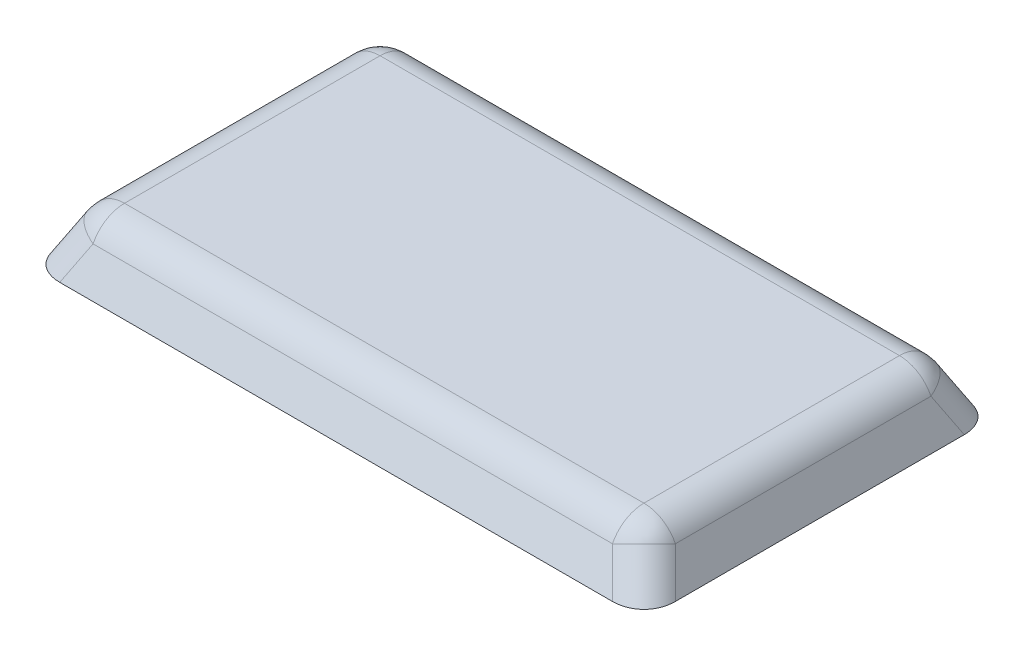
ISO-10303-21;
HEADER;
FILE_DESCRIPTION(('STEP AP214'),'2;1');
FILE_NAME('part.step','',(''),(''),'','','');
FILE_SCHEMA(('AUTOMOTIVE_DESIGN { 1 0 10303 214 1 1 1 1 }'));
ENDSEC;
DATA;
#1=APPLICATION_CONTEXT('core data for automotive mechanical design processes');
#2=APPLICATION_PROTOCOL_DEFINITION('international standard','automotive_design',2000,#1);
#3=PRODUCT_CONTEXT('',#1,'mechanical');
#4=PRODUCT('Part','Part','',(#3));
#5=PRODUCT_RELATED_PRODUCT_CATEGORY('part','',(#4));
#6=PRODUCT_DEFINITION_FORMATION('','',#4);
#7=PRODUCT_DEFINITION_CONTEXT('part definition',#1,'design');
#8=PRODUCT_DEFINITION('design','',#6,#7);
#9=PRODUCT_DEFINITION_SHAPE('','',#8);
#10=(LENGTH_UNIT() NAMED_UNIT(*) SI_UNIT(.MILLI.,.METRE.));
#11=(NAMED_UNIT(*) PLANE_ANGLE_UNIT() SI_UNIT($,.RADIAN.));
#12=(NAMED_UNIT(*) SI_UNIT($,.STERADIAN.) SOLID_ANGLE_UNIT());
#13=UNCERTAINTY_MEASURE_WITH_UNIT(LENGTH_MEASURE(1.E-05),#10,'distance_accuracy_value','');
#14=(GEOMETRIC_REPRESENTATION_CONTEXT(3) GLOBAL_UNCERTAINTY_ASSIGNED_CONTEXT((#13)) GLOBAL_UNIT_ASSIGNED_CONTEXT((#10,
#11,#12)) REPRESENTATION_CONTEXT('',''));
#15=CARTESIAN_POINT('',(0.,0.,0.));
#16=DIRECTION('',(0.,0.,1.));
#17=DIRECTION('',(1.,0.,0.));
#18=AXIS2_PLACEMENT_3D('',#15,#16,#17);
#19=CARTESIAN_POINT('',(0.,6.,0.));
#20=DIRECTION('',(0.,-1.,0.));
#21=DIRECTION('',(0.,0.,-1.));
#22=AXIS2_PLACEMENT_3D('',#19,#20,#21);
#23=PLANE('',#22);
#24=DIRECTION('',(-1.,0.,0.));
#25=VECTOR('',#24,1.);
#26=CARTESIAN_POINT('',(0.,6.,-14.5278640450004));
#27=LINE('',#26,#25);
#28=CARTESIAN_POINT('',(29.5278640450004,6.,-14.5278640450004));
#29=VERTEX_POINT('',#28);
#30=CARTESIAN_POINT('',(-29.5278640450004,6.,-14.5278640450004));
#31=VERTEX_POINT('',#30);
#32=EDGE_CURVE('E196',#29,#31,#27,.T.);
#33=ORIENTED_EDGE('',*,*,#32,.T.);
#34=DIRECTION('',(0.,0.,1.));
#35=VECTOR('',#34,1.);
#36=CARTESIAN_POINT('',(-29.5278640450004,6.,0.));
#37=LINE('',#36,#35);
#38=CARTESIAN_POINT('',(-29.5278640450004,6.,14.5278640450004));
#39=VERTEX_POINT('',#38);
#40=EDGE_CURVE('E203',#31,#39,#37,.T.);
#41=ORIENTED_EDGE('',*,*,#40,.T.);
#42=DIRECTION('',(1.,0.,0.));
#43=VECTOR('',#42,1.);
#44=CARTESIAN_POINT('',(0.,6.,14.5278640450004));
#45=LINE('',#44,#43);
#46=CARTESIAN_POINT('',(29.5278640450004,6.,14.5278640450004));
#47=VERTEX_POINT('',#46);
#48=EDGE_CURVE('E193',#39,#47,#45,.T.);
#49=ORIENTED_EDGE('',*,*,#48,.T.);
#50=DIRECTION('',(0.,0.,-1.));
#51=VECTOR('',#50,1.);
#52=CARTESIAN_POINT('',(29.5278640450004,6.,0.));
#53=LINE('',#52,#51);
#54=EDGE_CURVE('E189',#47,#29,#53,.T.);
#55=ORIENTED_EDGE('',*,*,#54,.T.);
#56=EDGE_LOOP('',(#33,#41,#49,#55));
#57=FACE_BOUND('',#56,.T.);
#58=ADVANCED_FACE('F54',(#57),#23,.F.);
#59=CARTESIAN_POINT('',(0.,0.,0.));
#60=DIRECTION('',(0.,-1.,0.));
#61=DIRECTION('',(0.,0.,-1.));
#62=AXIS2_PLACEMENT_3D('',#59,#60,#61);
#63=PLANE('',#62);
#64=DIRECTION('',(1.,0.,0.));
#65=VECTOR('',#64,1.);
#66=CARTESIAN_POINT('',(-35.,0.,20.));
#67=LINE('',#66,#65);
#68=CARTESIAN_POINT('',(-31.4222912360003,0.,20.));
#69=VERTEX_POINT('',#68);
#70=CARTESIAN_POINT('',(31.4222912360003,0.,20.));
#71=VERTEX_POINT('',#70);
#72=EDGE_CURVE('E158',#69,#71,#67,.T.);
#73=ORIENTED_EDGE('',*,*,#72,.F.);
#74=CARTESIAN_POINT('',(-30.5278640450004,0.,15.5278640450004));
#75=DIRECTION('',(0.,-1.,0.));
#76=DIRECTION('',(0.707106781186546,0.,-0.70710678118655));
#77=AXIS2_PLACEMENT_3D('',#74,#75,#76);
#78=ELLIPSE('',#77,4.89897948556635,4.);
#79=CARTESIAN_POINT('',(-35.,0.,16.4222912360003));
#80=VERTEX_POINT('',#79);
#81=EDGE_CURVE('E156',#69,#80,#78,.T.);
#82=ORIENTED_EDGE('',*,*,#81,.T.);
#83=DIRECTION('',(0.,0.,1.));
#84=VECTOR('',#83,1.);
#85=CARTESIAN_POINT('',(-35.,0.,20.));
#86=LINE('',#85,#84);
#87=CARTESIAN_POINT('',(-35.,0.,-16.4222912360003));
#88=VERTEX_POINT('',#87);
#89=EDGE_CURVE('E56',#88,#80,#86,.T.);
#90=ORIENTED_EDGE('',*,*,#89,.F.);
#91=CARTESIAN_POINT('',(-30.5278640450004,0.,-15.5278640450004));
#92=DIRECTION('',(0.,-1.,0.));
#93=DIRECTION('',(0.707106781186545,0.,0.70710678118655));
#94=AXIS2_PLACEMENT_3D('',#91,#92,#93);
#95=ELLIPSE('',#94,4.89897948556635,4.);
#96=CARTESIAN_POINT('',(-31.4222912360003,0.,-20.));
#97=VERTEX_POINT('',#96);
#98=EDGE_CURVE('E153',#88,#97,#95,.T.);
#99=ORIENTED_EDGE('',*,*,#98,.T.);
#100=DIRECTION('',(-1.,0.,0.));
#101=VECTOR('',#100,1.);
#102=CARTESIAN_POINT('',(-35.,0.,-20.));
#103=LINE('',#102,#101);
#104=CARTESIAN_POINT('',(31.4222912360004,0.,-20.));
#105=VERTEX_POINT('',#104);
#106=EDGE_CURVE('E157',#105,#97,#103,.T.);
#107=ORIENTED_EDGE('',*,*,#106,.F.);
#108=CARTESIAN_POINT('',(30.5278640450004,0.,-15.5278640450004));
#109=DIRECTION('',(0.,-1.,0.));
#110=DIRECTION('',(-0.707106781186547,0.,0.707106781186548));
#111=AXIS2_PLACEMENT_3D('',#108,#109,#110);
#112=ELLIPSE('',#111,4.89897948556636,4.);
#113=CARTESIAN_POINT('',(35.,0.,-16.4222912360003));
#114=VERTEX_POINT('',#113);
#115=EDGE_CURVE('E167',#105,#114,#112,.T.);
#116=ORIENTED_EDGE('',*,*,#115,.T.);
#117=DIRECTION('',(0.,0.,-1.));
#118=VECTOR('',#117,1.);
#119=CARTESIAN_POINT('',(35.,0.,20.));
#120=LINE('',#119,#118);
#121=CARTESIAN_POINT('',(35.,0.,16.4222912360003));
#122=VERTEX_POINT('',#121);
#123=EDGE_CURVE('E259',#122,#114,#120,.T.);
#124=ORIENTED_EDGE('',*,*,#123,.F.);
#125=CARTESIAN_POINT('',(30.5278640450004,0.,15.5278640450004));
#126=DIRECTION('',(0.,-1.,0.));
#127=DIRECTION('',(-0.707106781186548,0.,-0.707106781186547));
#128=AXIS2_PLACEMENT_3D('',#125,#126,#127);
#129=ELLIPSE('',#128,4.89897948556636,4.);
#130=EDGE_CURVE('E175',#122,#71,#129,.T.);
#131=ORIENTED_EDGE('',*,*,#130,.T.);
#132=EDGE_LOOP('',(#73,#82,#90,#99,#107,#116,#124,#131));
#133=FACE_BOUND('',#132,.T.);
#134=ADVANCED_FACE('F151',(#133),#63,.T.);
#135=CARTESIAN_POINT('',(0.,8.,16.));
#136=DIRECTION('',(0.,-0.447213595499958,-0.894427190999916));
#137=DIRECTION('',(0.,0.894427190999916,-0.447213595499958));
#138=AXIS2_PLACEMENT_3D('',#135,#136,#137);
#139=PLANE('',#138);
#140=DIRECTION('',(1.,0.,0.));
#141=VECTOR('',#140,1.);
#142=CARTESIAN_POINT('',(0.,3.78885438199983,18.1055728090001));
#143=LINE('',#142,#141);
#144=CARTESIAN_POINT('',(29.5278640450004,3.78885438199983,18.1055728090001));
#145=VERTEX_POINT('',#144);
#146=CARTESIAN_POINT('',(-29.5278640450004,3.78885438199983,18.1055728090001));
#147=VERTEX_POINT('',#146);
#148=EDGE_CURVE('E310',#145,#147,#143,.F.);
#149=ORIENTED_EDGE('',*,*,#148,.T.);
#150=DIRECTION('',(0.408248290463861,0.816496580927727,-0.408248290463863));
#151=VECTOR('',#150,1.);
#152=CARTESIAN_POINT('',(-22.8519093633337,17.1407637453334,11.4296181273333));
#153=LINE('',#152,#151);
#154=EDGE_CURVE('E314',#147,#69,#153,.F.);
#155=ORIENTED_EDGE('',*,*,#154,.T.);
#156=ORIENTED_EDGE('',*,*,#72,.T.);
#157=DIRECTION('',(-0.408248290463863,0.816496580927726,-0.408248290463863));
#158=VECTOR('',#157,1.);
#159=CARTESIAN_POINT('',(22.8519093633336,17.1407637453335,11.4296181273333));
#160=LINE('',#159,#158);
#161=EDGE_CURVE('E308',#71,#145,#160,.T.);
#162=ORIENTED_EDGE('',*,*,#161,.T.);
#163=EDGE_LOOP('',(#149,#155,#156,#162));
#164=FACE_BOUND('',#163,.T.);
#165=ADVANCED_FACE('F282',(#164),#139,.F.);
#166=CARTESIAN_POINT('',(-28.0000000000001,13.9999999999999,0.));
#167=DIRECTION('',(0.894427190999917,-0.447213595499956,0.));
#168=DIRECTION('',(0.447213595499956,0.894427190999917,0.));
#169=AXIS2_PLACEMENT_3D('',#166,#167,#168);
#170=PLANE('',#169);
#171=ORIENTED_EDGE('',*,*,#89,.T.);
#172=DIRECTION('',(0.408248290463861,0.816496580927727,-0.408248290463863));
#173=VECTOR('',#172,1.);
#174=CARTESIAN_POINT('',(-26.4296181273333,17.1407637453334,7.85190936333363));
#175=LINE('',#174,#173);
#176=CARTESIAN_POINT('',(-33.1055728090001,3.78885438199982,14.5278640450004));
#177=VERTEX_POINT('',#176);
#178=EDGE_CURVE('E148',#80,#177,#175,.T.);
#179=ORIENTED_EDGE('',*,*,#178,.T.);
#180=DIRECTION('',(0.,0.,1.));
#181=VECTOR('',#180,1.);
#182=CARTESIAN_POINT('',(-33.1055728090001,3.78885438199982,0.));
#183=LINE('',#182,#181);
#184=CARTESIAN_POINT('',(-33.1055728090001,3.78885438199982,-14.5278640450004));
#185=VERTEX_POINT('',#184);
#186=EDGE_CURVE('E138',#177,#185,#183,.F.);
#187=ORIENTED_EDGE('',*,*,#186,.T.);
#188=DIRECTION('',(0.408248290463861,0.816496580927727,0.408248290463864));
#189=VECTOR('',#188,1.);
#190=CARTESIAN_POINT('',(-26.4296181273333,17.1407637453334,-7.85190936333362));
#191=LINE('',#190,#189);
#192=EDGE_CURVE('E132',#185,#88,#191,.F.);
#193=ORIENTED_EDGE('',*,*,#192,.T.);
#194=EDGE_LOOP('',(#171,#179,#187,#193));
#195=FACE_BOUND('',#194,.T.);
#196=ADVANCED_FACE('F134',(#195),#170,.F.);
#197=CARTESIAN_POINT('',(28.,14.,0.));
#198=DIRECTION('',(-0.894427190999916,-0.447213595499958,0.));
#199=DIRECTION('',(0.447213595499958,-0.894427190999916,0.));
#200=AXIS2_PLACEMENT_3D('',#197,#198,#199);
#201=PLANE('',#200);
#202=ORIENTED_EDGE('',*,*,#123,.T.);
#203=DIRECTION('',(-0.408248290463863,0.816496580927726,0.408248290463863));
#204=VECTOR('',#203,1.);
#205=CARTESIAN_POINT('',(26.4296181273333,17.1407637453335,-7.8519093633336));
#206=LINE('',#205,#204);
#207=CARTESIAN_POINT('',(33.1055728090001,3.78885438199983,-14.5278640450004));
#208=VERTEX_POINT('',#207);
#209=EDGE_CURVE('E12',#114,#208,#206,.T.);
#210=ORIENTED_EDGE('',*,*,#209,.T.);
#211=DIRECTION('',(0.,0.,-1.));
#212=VECTOR('',#211,1.);
#213=CARTESIAN_POINT('',(33.1055728090001,3.78885438199984,0.));
#214=LINE('',#213,#212);
#215=CARTESIAN_POINT('',(33.1055728090001,3.78885438199983,14.5278640450004));
#216=VERTEX_POINT('',#215);
#217=EDGE_CURVE('E67',#208,#216,#214,.F.);
#218=ORIENTED_EDGE('',*,*,#217,.T.);
#219=DIRECTION('',(-0.408248290463863,0.816496580927726,-0.408248290463863));
#220=VECTOR('',#219,1.);
#221=CARTESIAN_POINT('',(26.4296181273333,17.1407637453335,7.85190936333361));
#222=LINE('',#221,#220);
#223=EDGE_CURVE('E202',#216,#122,#222,.F.);
#224=ORIENTED_EDGE('',*,*,#223,.T.);
#225=EDGE_LOOP('',(#202,#210,#218,#224));
#226=FACE_BOUND('',#225,.T.);
#227=ADVANCED_FACE('F334',(#226),#201,.F.);
#228=CARTESIAN_POINT('',(0.,8.00000000000001,-16.));
#229=DIRECTION('',(0.,-0.447213595499958,0.894427190999916));
#230=DIRECTION('',(0.,-0.894427190999916,-0.447213595499958));
#231=AXIS2_PLACEMENT_3D('',#228,#229,#230);
#232=PLANE('',#231);
#233=ORIENTED_EDGE('',*,*,#106,.T.);
#234=DIRECTION('',(0.408248290463861,0.816496580927727,0.408248290463864));
#235=VECTOR('',#234,1.);
#236=CARTESIAN_POINT('',(-22.8519093633337,17.1407637453334,-11.4296181273333));
#237=LINE('',#236,#235);
#238=CARTESIAN_POINT('',(-29.5278640450004,3.78885438199983,-18.1055728090001));
#239=VERTEX_POINT('',#238);
#240=EDGE_CURVE('E163',#97,#239,#237,.T.);
#241=ORIENTED_EDGE('',*,*,#240,.T.);
#242=DIRECTION('',(-1.,0.,0.));
#243=VECTOR('',#242,1.);
#244=CARTESIAN_POINT('',(0.,3.78885438199983,-18.1055728090001));
#245=LINE('',#244,#243);
#246=CARTESIAN_POINT('',(29.5278640450004,3.78885438199983,-18.1055728090001));
#247=VERTEX_POINT('',#246);
#248=EDGE_CURVE('E181',#239,#247,#245,.F.);
#249=ORIENTED_EDGE('',*,*,#248,.T.);
#250=DIRECTION('',(-0.408248290463863,0.816496580927726,0.408248290463863));
#251=VECTOR('',#250,1.);
#252=CARTESIAN_POINT('',(22.8519093633336,17.1407637453335,-11.4296181273333));
#253=LINE('',#252,#251);
#254=EDGE_CURVE('E168',#247,#105,#253,.F.);
#255=ORIENTED_EDGE('',*,*,#254,.T.);
#256=EDGE_LOOP('',(#233,#241,#249,#255));
#257=FACE_BOUND('',#256,.T.);
#258=ADVANCED_FACE('F342',(#257),#232,.F.);
#259=CARTESIAN_POINT('',(22.8519093633336,15.3519093633336,-7.8519093633336));
#260=DIRECTION('',(-0.408248290463863,0.816496580927726,0.408248290463863));
#261=DIRECTION('',(0.,-0.447213595499958,0.894427190999916));
#262=AXIS2_PLACEMENT_3D('',#259,#260,#261);
#263=CYLINDRICAL_SURFACE('',#262,4.);
#264=CARTESIAN_POINT('',(29.5278640450004,2.,-14.5278640450004));
#265=DIRECTION('',(-0.408248290463863,0.816496580927726,0.408248290463862));
#266=DIRECTION('',(-0.894427190999916,-0.447213595499958,0.));
#267=AXIS2_PLACEMENT_3D('',#264,#265,#266);
#268=CIRCLE('',#267,4.);
#269=EDGE_CURVE('E254',#208,#247,#268,.T.);
#270=ORIENTED_EDGE('',*,*,#269,.F.);
#271=ORIENTED_EDGE('',*,*,#209,.F.);
#272=ORIENTED_EDGE('',*,*,#115,.F.);
#273=ORIENTED_EDGE('',*,*,#254,.F.);
#274=EDGE_LOOP('',(#270,#271,#272,#273));
#275=FACE_BOUND('',#274,.T.);
#276=ADVANCED_FACE('F60',(#275),#263,.T.);
#277=CARTESIAN_POINT('',(29.5278640450004,2.,-14.5278640450004));
#278=DIRECTION('',(0.,1.,0.));
#279=DIRECTION('',(-1.,0.,0.));
#280=AXIS2_PLACEMENT_3D('',#277,#278,#279);
#281=SPHERICAL_SURFACE('',#280,4.);
#282=CARTESIAN_POINT('',(29.5278640450004,2.,-14.5278640450004));
#283=DIRECTION('',(0.,0.,-1.));
#284=DIRECTION('',(-1.,0.,0.));
#285=AXIS2_PLACEMENT_3D('',#282,#283,#284);
#286=CIRCLE('',#285,4.);
#287=EDGE_CURVE('E250',#208,#29,#286,.F.);
#288=ORIENTED_EDGE('',*,*,#287,.F.);
#289=ORIENTED_EDGE('',*,*,#269,.T.);
#290=CARTESIAN_POINT('',(29.5278640450004,2.,-14.5278640450004));
#291=DIRECTION('',(1.,0.,0.));
#292=DIRECTION('',(0.,1.,0.));
#293=AXIS2_PLACEMENT_3D('',#290,#291,#292);
#294=CIRCLE('',#293,4.);
#295=EDGE_CURVE('E253',#29,#247,#294,.F.);
#296=ORIENTED_EDGE('',*,*,#295,.F.);
#297=EDGE_LOOP('',(#288,#289,#296));
#298=FACE_BOUND('',#297,.T.);
#299=ADVANCED_FACE('F390',(#298),#281,.T.);
#300=CARTESIAN_POINT('',(-22.8519093633337,15.3519093633336,-7.85190936333362));
#301=DIRECTION('',(0.408248290463861,0.816496580927727,0.408248290463864));
#302=DIRECTION('',(0.,-0.447213595499958,0.894427190999916));
#303=AXIS2_PLACEMENT_3D('',#300,#301,#302);
#304=CYLINDRICAL_SURFACE('',#303,4.);
#305=ORIENTED_EDGE('',*,*,#98,.F.);
#306=ORIENTED_EDGE('',*,*,#192,.F.);
#307=CARTESIAN_POINT('',(-29.5278640450004,2.,-14.5278640450004));
#308=DIRECTION('',(0.408248290463861,0.816496580927727,0.408248290463864));
#309=DIRECTION('',(0.,-0.447213595499958,0.894427190999916));
#310=AXIS2_PLACEMENT_3D('',#307,#308,#309);
#311=CIRCLE('',#310,4.);
#312=EDGE_CURVE('E243',#239,#185,#311,.T.);
#313=ORIENTED_EDGE('',*,*,#312,.F.);
#314=ORIENTED_EDGE('',*,*,#240,.F.);
#315=EDGE_LOOP('',(#305,#306,#313,#314));
#316=FACE_BOUND('',#315,.T.);
#317=ADVANCED_FACE('F162',(#316),#304,.T.);
#318=CARTESIAN_POINT('',(0.,2.,-14.5278640450004));
#319=DIRECTION('',(-1.,0.,0.));
#320=DIRECTION('',(0.,0.,1.));
#321=AXIS2_PLACEMENT_3D('',#318,#319,#320);
#322=CYLINDRICAL_SURFACE('',#321,4.);
#323=ORIENTED_EDGE('',*,*,#295,.T.);
#324=ORIENTED_EDGE('',*,*,#248,.F.);
#325=CARTESIAN_POINT('',(-29.5278640450004,2.,-14.5278640450004));
#326=DIRECTION('',(-1.,0.,0.));
#327=DIRECTION('',(0.,0.,1.));
#328=AXIS2_PLACEMENT_3D('',#325,#326,#327);
#329=CIRCLE('',#328,4.);
#330=EDGE_CURVE('E238',#31,#239,#329,.T.);
#331=ORIENTED_EDGE('',*,*,#330,.F.);
#332=ORIENTED_EDGE('',*,*,#32,.F.);
#333=EDGE_LOOP('',(#323,#324,#331,#332));
#334=FACE_BOUND('',#333,.T.);
#335=ADVANCED_FACE('F381',(#334),#322,.T.);
#336=CARTESIAN_POINT('',(29.5278640450004,2.,0.));
#337=DIRECTION('',(0.,0.,-1.));
#338=DIRECTION('',(-1.,0.,0.));
#339=AXIS2_PLACEMENT_3D('',#336,#337,#338);
#340=CYLINDRICAL_SURFACE('',#339,4.);
#341=ORIENTED_EDGE('',*,*,#287,.T.);
#342=ORIENTED_EDGE('',*,*,#54,.F.);
#343=CARTESIAN_POINT('',(29.5278640450004,2.,14.5278640450004));
#344=DIRECTION('',(0.,0.,1.));
#345=DIRECTION('',(0.,-1.,0.));
#346=AXIS2_PLACEMENT_3D('',#343,#344,#345);
#347=CIRCLE('',#346,4.);
#348=EDGE_CURVE('E237',#216,#47,#347,.T.);
#349=ORIENTED_EDGE('',*,*,#348,.F.);
#350=ORIENTED_EDGE('',*,*,#217,.F.);
#351=EDGE_LOOP('',(#341,#342,#349,#350));
#352=FACE_BOUND('',#351,.T.);
#353=ADVANCED_FACE('F380',(#352),#340,.T.);
#354=CARTESIAN_POINT('',(22.8519093633336,15.3519093633336,7.85190936333361));
#355=DIRECTION('',(-0.408248290463863,0.816496580927726,-0.408248290463863));
#356=DIRECTION('',(-0.894427190999916,-0.447213595499958,0.));
#357=AXIS2_PLACEMENT_3D('',#354,#355,#356);
#358=CYLINDRICAL_SURFACE('',#357,4.);
#359=ORIENTED_EDGE('',*,*,#130,.F.);
#360=ORIENTED_EDGE('',*,*,#223,.F.);
#361=CARTESIAN_POINT('',(29.5278640450004,2.,14.5278640450004));
#362=DIRECTION('',(-0.408248290463863,0.816496580927726,-0.408248290463863));
#363=DIRECTION('',(-0.894427190999916,-0.447213595499958,0.));
#364=AXIS2_PLACEMENT_3D('',#361,#362,#363);
#365=CIRCLE('',#364,4.);
#366=EDGE_CURVE('E235',#145,#216,#365,.T.);
#367=ORIENTED_EDGE('',*,*,#366,.F.);
#368=ORIENTED_EDGE('',*,*,#161,.F.);
#369=EDGE_LOOP('',(#359,#360,#367,#368));
#370=FACE_BOUND('',#369,.T.);
#371=ADVANCED_FACE('F373',(#370),#358,.T.);
#372=CARTESIAN_POINT('',(-29.5278640450004,2.,-14.5278640450004));
#373=DIRECTION('',(0.,1.,0.));
#374=DIRECTION('',(0.,0.,1.));
#375=AXIS2_PLACEMENT_3D('',#372,#373,#374);
#376=SPHERICAL_SURFACE('',#375,4.);
#377=ORIENTED_EDGE('',*,*,#330,.T.);
#378=ORIENTED_EDGE('',*,*,#312,.T.);
#379=CARTESIAN_POINT('',(-29.5278640450004,2.,-14.5278640450004));
#380=DIRECTION('',(0.,0.,-1.));
#381=DIRECTION('',(0.,1.,0.));
#382=AXIS2_PLACEMENT_3D('',#379,#380,#381);
#383=CIRCLE('',#382,4.);
#384=EDGE_CURVE('E227',#31,#185,#383,.F.);
#385=ORIENTED_EDGE('',*,*,#384,.F.);
#386=EDGE_LOOP('',(#377,#378,#385));
#387=FACE_BOUND('',#386,.T.);
#388=ADVANCED_FACE('F369',(#387),#376,.T.);
#389=CARTESIAN_POINT('',(29.5278640450004,2.,14.5278640450004));
#390=DIRECTION('',(0.,1.,0.));
#391=DIRECTION('',(-1.,0.,0.));
#392=AXIS2_PLACEMENT_3D('',#389,#390,#391);
#393=SPHERICAL_SURFACE('',#392,4.);
#394=ORIENTED_EDGE('',*,*,#366,.T.);
#395=ORIENTED_EDGE('',*,*,#348,.T.);
#396=CARTESIAN_POINT('',(29.5278640450004,2.,14.5278640450004));
#397=DIRECTION('',(1.,0.,0.));
#398=DIRECTION('',(0.,0.,-1.));
#399=AXIS2_PLACEMENT_3D('',#396,#397,#398);
#400=CIRCLE('',#399,4.);
#401=EDGE_CURVE('E221',#145,#47,#400,.F.);
#402=ORIENTED_EDGE('',*,*,#401,.F.);
#403=EDGE_LOOP('',(#394,#395,#402));
#404=FACE_BOUND('',#403,.T.);
#405=ADVANCED_FACE('F364',(#404),#393,.T.);
#406=CARTESIAN_POINT('',(-29.5278640450004,2.,0.));
#407=DIRECTION('',(0.,0.,1.));
#408=DIRECTION('',(1.,0.,0.));
#409=AXIS2_PLACEMENT_3D('',#406,#407,#408);
#410=CYLINDRICAL_SURFACE('',#409,4.);
#411=ORIENTED_EDGE('',*,*,#384,.T.);
#412=ORIENTED_EDGE('',*,*,#186,.F.);
#413=CARTESIAN_POINT('',(-29.5278640450004,2.,14.5278640450004));
#414=DIRECTION('',(0.,0.,1.));
#415=DIRECTION('',(1.,0.,0.));
#416=AXIS2_PLACEMENT_3D('',#413,#414,#415);
#417=CIRCLE('',#416,4.);
#418=EDGE_CURVE('E219',#39,#177,#417,.T.);
#419=ORIENTED_EDGE('',*,*,#418,.F.);
#420=ORIENTED_EDGE('',*,*,#40,.F.);
#421=EDGE_LOOP('',(#411,#412,#419,#420));
#422=FACE_BOUND('',#421,.T.);
#423=ADVANCED_FACE('F363',(#422),#410,.T.);
#424=CARTESIAN_POINT('',(0.,2.,14.5278640450004));
#425=DIRECTION('',(1.,0.,0.));
#426=DIRECTION('',(0.,0.,-1.));
#427=AXIS2_PLACEMENT_3D('',#424,#425,#426);
#428=CYLINDRICAL_SURFACE('',#427,4.);
#429=ORIENTED_EDGE('',*,*,#401,.T.);
#430=ORIENTED_EDGE('',*,*,#48,.F.);
#431=CARTESIAN_POINT('',(-29.5278640450004,2.,14.5278640450004));
#432=DIRECTION('',(-1.,0.,0.));
#433=DIRECTION('',(0.,-1.,0.));
#434=AXIS2_PLACEMENT_3D('',#431,#432,#433);
#435=CIRCLE('',#434,4.);
#436=EDGE_CURVE('E220',#147,#39,#435,.T.);
#437=ORIENTED_EDGE('',*,*,#436,.F.);
#438=ORIENTED_EDGE('',*,*,#148,.F.);
#439=EDGE_LOOP('',(#429,#430,#437,#438));
#440=FACE_BOUND('',#439,.T.);
#441=ADVANCED_FACE('F360',(#440),#428,.T.);
#442=CARTESIAN_POINT('',(-29.5278640450004,2.,14.5278640450004));
#443=DIRECTION('',(0.,1.,0.));
#444=DIRECTION('',(0.,0.,1.));
#445=AXIS2_PLACEMENT_3D('',#442,#443,#444);
#446=SPHERICAL_SURFACE('',#445,4.);
#447=ORIENTED_EDGE('',*,*,#436,.T.);
#448=ORIENTED_EDGE('',*,*,#418,.T.);
#449=CARTESIAN_POINT('',(-29.5278640450004,2.,14.5278640450004));
#450=DIRECTION('',(0.408248290463861,0.816496580927727,-0.408248290463863));
#451=DIRECTION('',(0.,0.447213595499958,0.894427190999916));
#452=AXIS2_PLACEMENT_3D('',#449,#450,#451);
#453=CIRCLE('',#452,4.);
#454=EDGE_CURVE('E212',#147,#177,#453,.F.);
#455=ORIENTED_EDGE('',*,*,#454,.F.);
#456=EDGE_LOOP('',(#447,#448,#455));
#457=FACE_BOUND('',#456,.T.);
#458=ADVANCED_FACE('F352',(#457),#446,.T.);
#459=CARTESIAN_POINT('',(-22.8519093633337,15.3519093633336,7.85190936333363));
#460=DIRECTION('',(0.408248290463861,0.816496580927727,-0.408248290463863));
#461=DIRECTION('',(0.,0.447213595499958,0.894427190999916));
#462=AXIS2_PLACEMENT_3D('',#459,#460,#461);
#463=CYLINDRICAL_SURFACE('',#462,4.);
#464=ORIENTED_EDGE('',*,*,#81,.F.);
#465=ORIENTED_EDGE('',*,*,#154,.F.);
#466=ORIENTED_EDGE('',*,*,#454,.T.);
#467=ORIENTED_EDGE('',*,*,#178,.F.);
#468=EDGE_LOOP('',(#464,#465,#466,#467));
#469=FACE_BOUND('',#468,.T.);
#470=ADVANCED_FACE('F348',(#469),#463,.T.);
#471=CLOSED_SHELL('',(#58,#134,#165,#196,#227,#258,#276,#299,#317,#335,#353,#371,#388,#405,#423,
#441,#458,#470));
#472=MANIFOLD_SOLID_BREP('B2',#471);
#473=ADVANCED_BREP_SHAPE_REPRESENTATION('',(#18,#472),#14);
#474=SHAPE_DEFINITION_REPRESENTATION(#9,#473);
ENDSEC;
END-ISO-10303-21;
